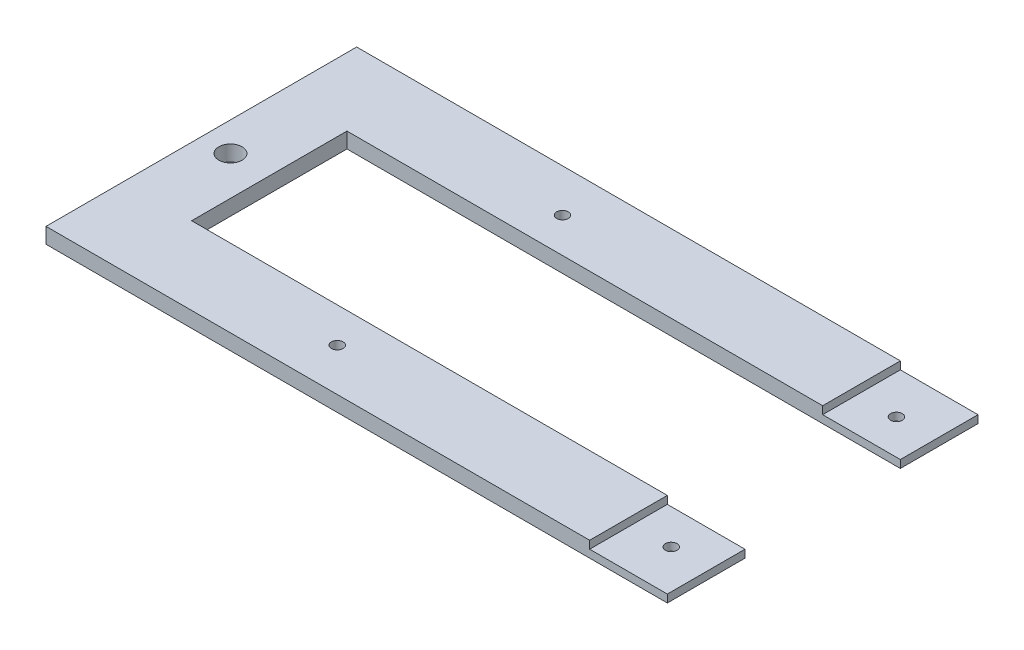
ISO-10303-21;
HEADER;
FILE_DESCRIPTION(('STEP AP214'),'2;1');
FILE_NAME('part.step','',(''),(''),'','','');
FILE_SCHEMA(('AUTOMOTIVE_DESIGN { 1 0 10303 214 1 1 1 1 }'));
ENDSEC;
DATA;
#1=APPLICATION_CONTEXT('core data for automotive mechanical design processes');
#2=APPLICATION_PROTOCOL_DEFINITION('international standard','automotive_design',2000,#1);
#3=PRODUCT_CONTEXT('',#1,'mechanical');
#4=PRODUCT('Part','Part','',(#3));
#5=PRODUCT_RELATED_PRODUCT_CATEGORY('part','',(#4));
#6=PRODUCT_DEFINITION_FORMATION('','',#4);
#7=PRODUCT_DEFINITION_CONTEXT('part definition',#1,'design');
#8=PRODUCT_DEFINITION('design','',#6,#7);
#9=PRODUCT_DEFINITION_SHAPE('','',#8);
#10=(LENGTH_UNIT() NAMED_UNIT(*) SI_UNIT(.MILLI.,.METRE.));
#11=(NAMED_UNIT(*) PLANE_ANGLE_UNIT() SI_UNIT($,.RADIAN.));
#12=(NAMED_UNIT(*) SI_UNIT($,.STERADIAN.) SOLID_ANGLE_UNIT());
#13=UNCERTAINTY_MEASURE_WITH_UNIT(LENGTH_MEASURE(1.E-05),#10,'distance_accuracy_value','');
#14=(GEOMETRIC_REPRESENTATION_CONTEXT(3) GLOBAL_UNCERTAINTY_ASSIGNED_CONTEXT((#13)) GLOBAL_UNIT_ASSIGNED_CONTEXT((#10,
#11,#12)) REPRESENTATION_CONTEXT('',''));
#15=CARTESIAN_POINT('',(0.,0.,0.));
#16=DIRECTION('',(0.,0.,1.));
#17=DIRECTION('',(1.,0.,0.));
#18=AXIS2_PLACEMENT_3D('',#15,#16,#17);
#19=CARTESIAN_POINT('',(0.,4.,0.));
#20=DIRECTION('',(0.,1.,0.));
#21=DIRECTION('',(0.,0.,1.));
#22=AXIS2_PLACEMENT_3D('',#19,#20,#21);
#23=PLANE('',#22);
#24=CARTESIAN_POINT('',(64.,4.,-29.));
#25=DIRECTION('',(0.,1.,0.));
#26=DIRECTION('',(0.,0.,1.));
#27=AXIS2_PLACEMENT_3D('',#24,#25,#26);
#28=CIRCLE('',#27,1.5);
#29=CARTESIAN_POINT('',(64.,4.,-27.5));
#30=VERTEX_POINT('',#29);
#31=EDGE_CURVE('E191',#30,#30,#28,.T.);
#32=ORIENTED_EDGE('',*,*,#31,.F.);
#33=EDGE_LOOP('',(#32));
#34=FACE_BOUND('',#33,.T.);
#35=CARTESIAN_POINT('',(64.,4.,29.));
#36=DIRECTION('',(0.,1.,0.));
#37=DIRECTION('',(0.,0.,1.));
#38=AXIS2_PLACEMENT_3D('',#35,#36,#37);
#39=CIRCLE('',#38,1.5);
#40=CARTESIAN_POINT('',(64.,4.,30.5));
#41=VERTEX_POINT('',#40);
#42=EDGE_CURVE('E188',#41,#41,#39,.F.);
#43=ORIENTED_EDGE('',*,*,#42,.T.);
#44=EDGE_LOOP('',(#43));
#45=FACE_BOUND('',#44,.T.);
#46=CARTESIAN_POINT('',(7.5,4.,0.));
#47=DIRECTION('',(0.,1.,0.));
#48=DIRECTION('',(0.,0.,1.));
#49=AXIS2_PLACEMENT_3D('',#46,#47,#48);
#50=CIRCLE('',#49,3.);
#51=CARTESIAN_POINT('',(7.5,4.,3.));
#52=VERTEX_POINT('',#51);
#53=EDGE_CURVE('E185',#52,#52,#50,.T.);
#54=ORIENTED_EDGE('',*,*,#53,.F.);
#55=EDGE_LOOP('',(#54));
#56=FACE_BOUND('',#55,.T.);
#57=DIRECTION('',(-1.,0.,0.));
#58=VECTOR('',#57,1.);
#59=CARTESIAN_POINT('',(0.,4.,-20.));
#60=LINE('',#59,#58);
#61=CARTESIAN_POINT('',(140.,4.,-20.));
#62=VERTEX_POINT('',#61);
#63=CARTESIAN_POINT('',(17.5,4.,-20.));
#64=VERTEX_POINT('',#63);
#65=EDGE_CURVE('E183',#62,#64,#60,.T.);
#66=ORIENTED_EDGE('',*,*,#65,.F.);
#67=DIRECTION('',(0.,0.,1.));
#68=VECTOR('',#67,1.);
#69=CARTESIAN_POINT('',(140.,4.,-20.));
#70=LINE('',#69,#68);
#71=CARTESIAN_POINT('',(140.,4.,-40.));
#72=VERTEX_POINT('',#71);
#73=EDGE_CURVE('E137',#72,#62,#70,.T.);
#74=ORIENTED_EDGE('',*,*,#73,.F.);
#75=DIRECTION('',(1.,0.,0.));
#76=VECTOR('',#75,1.);
#77=CARTESIAN_POINT('',(0.,4.,-40.));
#78=LINE('',#77,#76);
#79=CARTESIAN_POINT('',(0.,4.,-40.));
#80=VERTEX_POINT('',#79);
#81=EDGE_CURVE('E168',#80,#72,#78,.T.);
#82=ORIENTED_EDGE('',*,*,#81,.F.);
#83=DIRECTION('',(0.,0.,-1.));
#84=VECTOR('',#83,1.);
#85=CARTESIAN_POINT('',(0.,4.,0.));
#86=LINE('',#85,#84);
#87=CARTESIAN_POINT('',(0.,4.,40.));
#88=VERTEX_POINT('',#87);
#89=EDGE_CURVE('E171',#88,#80,#86,.T.);
#90=ORIENTED_EDGE('',*,*,#89,.F.);
#91=DIRECTION('',(1.,0.,0.));
#92=VECTOR('',#91,1.);
#93=CARTESIAN_POINT('',(0.,4.,40.));
#94=LINE('',#93,#92);
#95=CARTESIAN_POINT('',(140.,4.,40.));
#96=VERTEX_POINT('',#95);
#97=EDGE_CURVE('E175',#88,#96,#94,.T.);
#98=ORIENTED_EDGE('',*,*,#97,.T.);
#99=DIRECTION('',(0.,0.,1.));
#100=VECTOR('',#99,1.);
#101=CARTESIAN_POINT('',(140.,4.,20.));
#102=LINE('',#101,#100);
#103=CARTESIAN_POINT('',(140.,4.,20.));
#104=VERTEX_POINT('',#103);
#105=EDGE_CURVE('E153',#104,#96,#102,.T.);
#106=ORIENTED_EDGE('',*,*,#105,.F.);
#107=DIRECTION('',(-1.,0.,0.));
#108=VECTOR('',#107,1.);
#109=CARTESIAN_POINT('',(0.,4.,20.));
#110=LINE('',#109,#108);
#111=CARTESIAN_POINT('',(17.5,4.,20.));
#112=VERTEX_POINT('',#111);
#113=EDGE_CURVE('E178',#104,#112,#110,.T.);
#114=ORIENTED_EDGE('',*,*,#113,.T.);
#115=DIRECTION('',(0.,0.,1.));
#116=VECTOR('',#115,1.);
#117=CARTESIAN_POINT('',(17.5,4.,0.));
#118=LINE('',#117,#116);
#119=EDGE_CURVE('E180',#64,#112,#118,.T.);
#120=ORIENTED_EDGE('',*,*,#119,.F.);
#121=EDGE_LOOP('',(#66,#74,#82,#90,#98,#106,#114,#120));
#122=FACE_BOUND('',#121,.T.);
#123=ADVANCED_FACE('F36',(#34,#45,#56,#122),#23,.T.);
#124=CARTESIAN_POINT('',(0.,4.,-40.));
#125=DIRECTION('',(0.,0.,-1.));
#126=DIRECTION('',(-1.,0.,0.));
#127=AXIS2_PLACEMENT_3D('',#124,#125,#126);
#128=PLANE('',#127);
#129=DIRECTION('',(1.,0.,0.));
#130=VECTOR('',#129,1.);
#131=CARTESIAN_POINT('',(140.,2.,-40.));
#132=LINE('',#131,#130);
#133=CARTESIAN_POINT('',(140.,2.,-40.));
#134=VERTEX_POINT('',#133);
#135=CARTESIAN_POINT('',(160.,2.,-40.));
#136=VERTEX_POINT('',#135);
#137=EDGE_CURVE('E132',#134,#136,#132,.T.);
#138=ORIENTED_EDGE('',*,*,#137,.T.);
#139=DIRECTION('',(0.,-1.,0.));
#140=VECTOR('',#139,1.);
#141=CARTESIAN_POINT('',(160.,4.,-40.));
#142=LINE('',#141,#140);
#143=CARTESIAN_POINT('',(160.,0.,-40.));
#144=VERTEX_POINT('',#143);
#145=EDGE_CURVE('E194',#136,#144,#142,.T.);
#146=ORIENTED_EDGE('',*,*,#145,.T.);
#147=DIRECTION('',(1.,0.,0.));
#148=VECTOR('',#147,1.);
#149=CARTESIAN_POINT('',(0.,0.,-40.));
#150=LINE('',#149,#148);
#151=CARTESIAN_POINT('',(0.,0.,-40.));
#152=VERTEX_POINT('',#151);
#153=EDGE_CURVE('E195',#152,#144,#150,.T.);
#154=ORIENTED_EDGE('',*,*,#153,.F.);
#155=DIRECTION('',(0.,-1.,0.));
#156=VECTOR('',#155,1.);
#157=CARTESIAN_POINT('',(0.,4.,-40.));
#158=LINE('',#157,#156);
#159=EDGE_CURVE('E11',#80,#152,#158,.T.);
#160=ORIENTED_EDGE('',*,*,#159,.F.);
#161=ORIENTED_EDGE('',*,*,#81,.T.);
#162=DIRECTION('',(0.,1.,0.));
#163=VECTOR('',#162,1.);
#164=CARTESIAN_POINT('',(140.,4.,-40.));
#165=LINE('',#164,#163);
#166=EDGE_CURVE('E60',#134,#72,#165,.T.);
#167=ORIENTED_EDGE('',*,*,#166,.F.);
#168=EDGE_LOOP('',(#138,#146,#154,#160,#161,#167));
#169=FACE_BOUND('',#168,.T.);
#170=ADVANCED_FACE('F38',(#169),#128,.T.);
#171=CARTESIAN_POINT('',(0.,4.,0.));
#172=DIRECTION('',(-1.,0.,0.));
#173=DIRECTION('',(0.,0.,1.));
#174=AXIS2_PLACEMENT_3D('',#171,#172,#173);
#175=PLANE('',#174);
#176=DIRECTION('',(0.,0.,-1.));
#177=VECTOR('',#176,1.);
#178=CARTESIAN_POINT('',(0.,0.,0.));
#179=LINE('',#178,#177);
#180=CARTESIAN_POINT('',(0.,0.,40.));
#181=VERTEX_POINT('',#180);
#182=EDGE_CURVE('E198',#181,#152,#179,.T.);
#183=ORIENTED_EDGE('',*,*,#182,.F.);
#184=DIRECTION('',(0.,-1.,0.));
#185=VECTOR('',#184,1.);
#186=CARTESIAN_POINT('',(0.,4.,40.));
#187=LINE('',#186,#185);
#188=EDGE_CURVE('E45',#88,#181,#187,.T.);
#189=ORIENTED_EDGE('',*,*,#188,.F.);
#190=ORIENTED_EDGE('',*,*,#89,.T.);
#191=ORIENTED_EDGE('',*,*,#159,.T.);
#192=EDGE_LOOP('',(#183,#189,#190,#191));
#193=FACE_BOUND('',#192,.T.);
#194=ADVANCED_FACE('F257',(#193),#175,.T.);
#195=CARTESIAN_POINT('',(0.,4.,40.));
#196=DIRECTION('',(0.,0.,-1.));
#197=DIRECTION('',(-1.,0.,0.));
#198=AXIS2_PLACEMENT_3D('',#195,#196,#197);
#199=PLANE('',#198);
#200=DIRECTION('',(0.,-1.,0.));
#201=VECTOR('',#200,1.);
#202=CARTESIAN_POINT('',(160.,4.,40.));
#203=LINE('',#202,#201);
#204=CARTESIAN_POINT('',(160.,2.,40.));
#205=VERTEX_POINT('',#204);
#206=CARTESIAN_POINT('',(160.,0.,40.));
#207=VERTEX_POINT('',#206);
#208=EDGE_CURVE('E241',#205,#207,#203,.T.);
#209=ORIENTED_EDGE('',*,*,#208,.F.);
#210=DIRECTION('',(1.,0.,0.));
#211=VECTOR('',#210,1.);
#212=CARTESIAN_POINT('',(140.,2.,40.));
#213=LINE('',#212,#211);
#214=CARTESIAN_POINT('',(140.,2.,40.));
#215=VERTEX_POINT('',#214);
#216=EDGE_CURVE('E160',#215,#205,#213,.T.);
#217=ORIENTED_EDGE('',*,*,#216,.F.);
#218=DIRECTION('',(0.,-1.,0.));
#219=VECTOR('',#218,1.);
#220=CARTESIAN_POINT('',(140.,4.,40.));
#221=LINE('',#220,#219);
#222=EDGE_CURVE('E156',#96,#215,#221,.T.);
#223=ORIENTED_EDGE('',*,*,#222,.F.);
#224=ORIENTED_EDGE('',*,*,#97,.F.);
#225=ORIENTED_EDGE('',*,*,#188,.T.);
#226=DIRECTION('',(1.,0.,0.));
#227=VECTOR('',#226,1.);
#228=CARTESIAN_POINT('',(0.,0.,40.));
#229=LINE('',#228,#227);
#230=EDGE_CURVE('E201',#181,#207,#229,.T.);
#231=ORIENTED_EDGE('',*,*,#230,.T.);
#232=EDGE_LOOP('',(#209,#217,#223,#224,#225,#231));
#233=FACE_BOUND('',#232,.T.);
#234=ADVANCED_FACE('F247',(#233),#199,.F.);
#235=CARTESIAN_POINT('',(160.,4.,0.));
#236=DIRECTION('',(-1.,0.,0.));
#237=DIRECTION('',(0.,0.,1.));
#238=AXIS2_PLACEMENT_3D('',#235,#236,#237);
#239=PLANE('',#238);
#240=DIRECTION('',(0.,-1.,0.));
#241=VECTOR('',#240,1.);
#242=CARTESIAN_POINT('',(160.,4.,20.));
#243=LINE('',#242,#241);
#244=CARTESIAN_POINT('',(160.,2.,20.));
#245=VERTEX_POINT('',#244);
#246=CARTESIAN_POINT('',(160.,0.,20.));
#247=VERTEX_POINT('',#246);
#248=EDGE_CURVE('E239',#245,#247,#243,.T.);
#249=ORIENTED_EDGE('',*,*,#248,.F.);
#250=DIRECTION('',(0.,0.,-1.));
#251=VECTOR('',#250,1.);
#252=CARTESIAN_POINT('',(160.,2.,20.));
#253=LINE('',#252,#251);
#254=EDGE_CURVE('E154',#205,#245,#253,.T.);
#255=ORIENTED_EDGE('',*,*,#254,.F.);
#256=ORIENTED_EDGE('',*,*,#208,.T.);
#257=DIRECTION('',(0.,0.,-1.));
#258=VECTOR('',#257,1.);
#259=CARTESIAN_POINT('',(160.,0.,0.));
#260=LINE('',#259,#258);
#261=EDGE_CURVE('E204',#207,#247,#260,.T.);
#262=ORIENTED_EDGE('',*,*,#261,.T.);
#263=EDGE_LOOP('',(#249,#255,#256,#262));
#264=FACE_BOUND('',#263,.T.);
#265=ADVANCED_FACE('F277',(#264),#239,.F.);
#266=CARTESIAN_POINT('',(0.,4.,20.));
#267=DIRECTION('',(0.,0.,1.));
#268=DIRECTION('',(1.,0.,0.));
#269=AXIS2_PLACEMENT_3D('',#266,#267,#268);
#270=PLANE('',#269);
#271=DIRECTION('',(0.,1.,0.));
#272=VECTOR('',#271,1.);
#273=CARTESIAN_POINT('',(140.,4.,20.));
#274=LINE('',#273,#272);
#275=CARTESIAN_POINT('',(140.,2.,20.));
#276=VERTEX_POINT('',#275);
#277=EDGE_CURVE('E52',#276,#104,#274,.T.);
#278=ORIENTED_EDGE('',*,*,#277,.F.);
#279=DIRECTION('',(1.,0.,0.));
#280=VECTOR('',#279,1.);
#281=CARTESIAN_POINT('',(140.,2.,20.));
#282=LINE('',#281,#280);
#283=EDGE_CURVE('E162',#276,#245,#282,.T.);
#284=ORIENTED_EDGE('',*,*,#283,.T.);
#285=ORIENTED_EDGE('',*,*,#248,.T.);
#286=DIRECTION('',(-1.,0.,0.));
#287=VECTOR('',#286,1.);
#288=CARTESIAN_POINT('',(0.,0.,20.));
#289=LINE('',#288,#287);
#290=CARTESIAN_POINT('',(17.5,0.,20.));
#291=VERTEX_POINT('',#290);
#292=EDGE_CURVE('E207',#247,#291,#289,.T.);
#293=ORIENTED_EDGE('',*,*,#292,.T.);
#294=DIRECTION('',(0.,-1.,0.));
#295=VECTOR('',#294,1.);
#296=CARTESIAN_POINT('',(17.5,4.,20.));
#297=LINE('',#296,#295);
#298=EDGE_CURVE('E237',#112,#291,#297,.T.);
#299=ORIENTED_EDGE('',*,*,#298,.F.);
#300=ORIENTED_EDGE('',*,*,#113,.F.);
#301=EDGE_LOOP('',(#278,#284,#285,#293,#299,#300));
#302=FACE_BOUND('',#301,.T.);
#303=ADVANCED_FACE('F273',(#302),#270,.F.);
#304=CARTESIAN_POINT('',(17.5,4.,0.));
#305=DIRECTION('',(1.,0.,0.));
#306=DIRECTION('',(0.,0.,-1.));
#307=AXIS2_PLACEMENT_3D('',#304,#305,#306);
#308=PLANE('',#307);
#309=DIRECTION('',(0.,0.,1.));
#310=VECTOR('',#309,1.);
#311=CARTESIAN_POINT('',(17.5,0.,0.));
#312=LINE('',#311,#310);
#313=CARTESIAN_POINT('',(17.5,0.,-20.));
#314=VERTEX_POINT('',#313);
#315=EDGE_CURVE('E210',#314,#291,#312,.T.);
#316=ORIENTED_EDGE('',*,*,#315,.F.);
#317=DIRECTION('',(0.,-1.,0.));
#318=VECTOR('',#317,1.);
#319=CARTESIAN_POINT('',(17.5,4.,-20.));
#320=LINE('',#319,#318);
#321=EDGE_CURVE('E235',#64,#314,#320,.T.);
#322=ORIENTED_EDGE('',*,*,#321,.F.);
#323=ORIENTED_EDGE('',*,*,#119,.T.);
#324=ORIENTED_EDGE('',*,*,#298,.T.);
#325=EDGE_LOOP('',(#316,#322,#323,#324));
#326=FACE_BOUND('',#325,.T.);
#327=ADVANCED_FACE('F268',(#326),#308,.T.);
#328=CARTESIAN_POINT('',(0.,4.,-20.));
#329=DIRECTION('',(0.,0.,1.));
#330=DIRECTION('',(1.,0.,0.));
#331=AXIS2_PLACEMENT_3D('',#328,#329,#330);
#332=PLANE('',#331);
#333=DIRECTION('',(1.,0.,0.));
#334=VECTOR('',#333,1.);
#335=CARTESIAN_POINT('',(140.,2.,-20.));
#336=LINE('',#335,#334);
#337=CARTESIAN_POINT('',(140.,2.,-20.));
#338=VERTEX_POINT('',#337);
#339=CARTESIAN_POINT('',(160.,2.,-20.));
#340=VERTEX_POINT('',#339);
#341=EDGE_CURVE('E129',#338,#340,#336,.T.);
#342=ORIENTED_EDGE('',*,*,#341,.F.);
#343=DIRECTION('',(0.,-1.,0.));
#344=VECTOR('',#343,1.);
#345=CARTESIAN_POINT('',(140.,4.,-20.));
#346=LINE('',#345,#344);
#347=EDGE_CURVE('E133',#62,#338,#346,.T.);
#348=ORIENTED_EDGE('',*,*,#347,.F.);
#349=ORIENTED_EDGE('',*,*,#65,.T.);
#350=ORIENTED_EDGE('',*,*,#321,.T.);
#351=DIRECTION('',(-1.,0.,0.));
#352=VECTOR('',#351,1.);
#353=CARTESIAN_POINT('',(0.,0.,-20.));
#354=LINE('',#353,#352);
#355=CARTESIAN_POINT('',(160.,0.,-20.));
#356=VERTEX_POINT('',#355);
#357=EDGE_CURVE('E213',#356,#314,#354,.T.);
#358=ORIENTED_EDGE('',*,*,#357,.F.);
#359=DIRECTION('',(0.,-1.,0.));
#360=VECTOR('',#359,1.);
#361=CARTESIAN_POINT('',(160.,4.,-20.));
#362=LINE('',#361,#360);
#363=EDGE_CURVE('E145',#340,#356,#362,.T.);
#364=ORIENTED_EDGE('',*,*,#363,.F.);
#365=EDGE_LOOP('',(#342,#348,#349,#350,#358,#364));
#366=FACE_BOUND('',#365,.T.);
#367=ADVANCED_FACE('F143',(#366),#332,.T.);
#368=CARTESIAN_POINT('',(150.,4.,-29.));
#369=DIRECTION('',(0.,-1.,0.));
#370=DIRECTION('',(0.,0.,-1.));
#371=AXIS2_PLACEMENT_3D('',#368,#369,#370);
#372=CYLINDRICAL_SURFACE('',#371,1.5);
#373=CARTESIAN_POINT('',(150.,2.,-29.));
#374=DIRECTION('',(0.,-1.,0.));
#375=DIRECTION('',(0.,0.,-1.));
#376=AXIS2_PLACEMENT_3D('',#373,#374,#375);
#377=CIRCLE('',#376,1.5);
#378=CARTESIAN_POINT('',(150.,2.,-30.5));
#379=VERTEX_POINT('',#378);
#380=EDGE_CURVE('E147',#379,#379,#377,.T.);
#381=ORIENTED_EDGE('',*,*,#380,.F.);
#382=EDGE_LOOP('',(#381));
#383=FACE_BOUND('',#382,.T.);
#384=CARTESIAN_POINT('',(150.,0.,-29.));
#385=DIRECTION('',(0.,1.,0.));
#386=DIRECTION('',(0.,0.,1.));
#387=AXIS2_PLACEMENT_3D('',#384,#385,#386);
#388=CIRCLE('',#387,1.5);
#389=CARTESIAN_POINT('',(150.,0.,-27.5));
#390=VERTEX_POINT('',#389);
#391=EDGE_CURVE('E228',#390,#390,#388,.T.);
#392=ORIENTED_EDGE('',*,*,#391,.F.);
#393=EDGE_LOOP('',(#392));
#394=FACE_BOUND('',#393,.T.);
#395=ADVANCED_FACE('F303',(#383,#394),#372,.F.);
#396=CARTESIAN_POINT('',(64.,4.,29.));
#397=DIRECTION('',(0.,-1.,0.));
#398=DIRECTION('',(0.,0.,-1.));
#399=AXIS2_PLACEMENT_3D('',#396,#397,#398);
#400=CYLINDRICAL_SURFACE('',#399,1.5);
#401=ORIENTED_EDGE('',*,*,#42,.F.);
#402=EDGE_LOOP('',(#401));
#403=FACE_BOUND('',#402,.T.);
#404=CARTESIAN_POINT('',(64.,0.,29.));
#405=DIRECTION('',(0.,1.,0.));
#406=DIRECTION('',(0.,0.,1.));
#407=AXIS2_PLACEMENT_3D('',#404,#405,#406);
#408=CIRCLE('',#407,1.5);
#409=CARTESIAN_POINT('',(64.,0.,30.5));
#410=VERTEX_POINT('',#409);
#411=EDGE_CURVE('E225',#410,#410,#408,.F.);
#412=ORIENTED_EDGE('',*,*,#411,.T.);
#413=EDGE_LOOP('',(#412));
#414=FACE_BOUND('',#413,.T.);
#415=ADVANCED_FACE('F306',(#403,#414),#400,.F.);
#416=CARTESIAN_POINT('',(7.5,4.,0.));
#417=DIRECTION('',(0.,-1.,0.));
#418=DIRECTION('',(0.,0.,-1.));
#419=AXIS2_PLACEMENT_3D('',#416,#417,#418);
#420=CYLINDRICAL_SURFACE('',#419,3.);
#421=ORIENTED_EDGE('',*,*,#53,.T.);
#422=EDGE_LOOP('',(#421));
#423=FACE_BOUND('',#422,.T.);
#424=CARTESIAN_POINT('',(7.5,0.,0.));
#425=DIRECTION('',(0.,1.,0.));
#426=DIRECTION('',(0.,0.,1.));
#427=AXIS2_PLACEMENT_3D('',#424,#425,#426);
#428=CIRCLE('',#427,3.);
#429=CARTESIAN_POINT('',(7.5,0.,3.));
#430=VERTEX_POINT('',#429);
#431=EDGE_CURVE('E222',#430,#430,#428,.T.);
#432=ORIENTED_EDGE('',*,*,#431,.F.);
#433=EDGE_LOOP('',(#432));
#434=FACE_BOUND('',#433,.T.);
#435=ADVANCED_FACE('F310',(#423,#434),#420,.F.);
#436=CARTESIAN_POINT('',(150.,4.,29.));
#437=DIRECTION('',(0.,-1.,0.));
#438=DIRECTION('',(0.,0.,-1.));
#439=AXIS2_PLACEMENT_3D('',#436,#437,#438);
#440=CYLINDRICAL_SURFACE('',#439,1.5);
#441=CARTESIAN_POINT('',(150.,2.,29.));
#442=DIRECTION('',(0.,-1.,0.));
#443=DIRECTION('',(0.,0.,-1.));
#444=AXIS2_PLACEMENT_3D('',#441,#442,#443);
#445=CIRCLE('',#444,1.5);
#446=CARTESIAN_POINT('',(150.,2.,27.5));
#447=VERTEX_POINT('',#446);
#448=EDGE_CURVE('E40',#447,#447,#445,.F.);
#449=ORIENTED_EDGE('',*,*,#448,.T.);
#450=EDGE_LOOP('',(#449));
#451=FACE_BOUND('',#450,.T.);
#452=CARTESIAN_POINT('',(150.,0.,29.));
#453=DIRECTION('',(0.,1.,0.));
#454=DIRECTION('',(0.,0.,1.));
#455=AXIS2_PLACEMENT_3D('',#452,#453,#454);
#456=CIRCLE('',#455,1.5);
#457=CARTESIAN_POINT('',(150.,0.,30.5));
#458=VERTEX_POINT('',#457);
#459=EDGE_CURVE('E219',#458,#458,#456,.F.);
#460=ORIENTED_EDGE('',*,*,#459,.T.);
#461=EDGE_LOOP('',(#460));
#462=FACE_BOUND('',#461,.T.);
#463=ADVANCED_FACE('F314',(#451,#462),#440,.F.);
#464=CARTESIAN_POINT('',(160.,4.,0.));
#465=DIRECTION('',(1.,0.,0.));
#466=DIRECTION('',(0.,0.,-1.));
#467=AXIS2_PLACEMENT_3D('',#464,#465,#466);
#468=PLANE('',#467);
#469=DIRECTION('',(0.,0.,-1.));
#470=VECTOR('',#469,1.);
#471=CARTESIAN_POINT('',(160.,2.,-20.));
#472=LINE('',#471,#470);
#473=EDGE_CURVE('E140',#340,#136,#472,.T.);
#474=ORIENTED_EDGE('',*,*,#473,.F.);
#475=ORIENTED_EDGE('',*,*,#363,.T.);
#476=DIRECTION('',(0.,0.,1.));
#477=VECTOR('',#476,1.);
#478=CARTESIAN_POINT('',(160.,0.,0.));
#479=LINE('',#478,#477);
#480=EDGE_CURVE('E216',#144,#356,#479,.T.);
#481=ORIENTED_EDGE('',*,*,#480,.F.);
#482=ORIENTED_EDGE('',*,*,#145,.F.);
#483=EDGE_LOOP('',(#474,#475,#481,#482));
#484=FACE_BOUND('',#483,.T.);
#485=ADVANCED_FACE('F264',(#484),#468,.T.);
#486=CARTESIAN_POINT('',(64.,4.,-29.));
#487=DIRECTION('',(0.,-1.,0.));
#488=DIRECTION('',(0.,0.,-1.));
#489=AXIS2_PLACEMENT_3D('',#486,#487,#488);
#490=CYLINDRICAL_SURFACE('',#489,1.5);
#491=ORIENTED_EDGE('',*,*,#31,.T.);
#492=EDGE_LOOP('',(#491));
#493=FACE_BOUND('',#492,.T.);
#494=CARTESIAN_POINT('',(64.,0.,-29.));
#495=DIRECTION('',(0.,1.,0.));
#496=DIRECTION('',(0.,0.,1.));
#497=AXIS2_PLACEMENT_3D('',#494,#495,#496);
#498=CIRCLE('',#497,1.5);
#499=CARTESIAN_POINT('',(64.,0.,-27.5));
#500=VERTEX_POINT('',#499);
#501=EDGE_CURVE('E172',#500,#500,#498,.T.);
#502=ORIENTED_EDGE('',*,*,#501,.F.);
#503=EDGE_LOOP('',(#502));
#504=FACE_BOUND('',#503,.T.);
#505=ADVANCED_FACE('F299',(#493,#504),#490,.F.);
#506=CARTESIAN_POINT('',(0.,0.,0.));
#507=DIRECTION('',(0.,1.,0.));
#508=DIRECTION('',(0.,0.,1.));
#509=AXIS2_PLACEMENT_3D('',#506,#507,#508);
#510=PLANE('',#509);
#511=ORIENTED_EDGE('',*,*,#153,.T.);
#512=ORIENTED_EDGE('',*,*,#480,.T.);
#513=ORIENTED_EDGE('',*,*,#357,.T.);
#514=ORIENTED_EDGE('',*,*,#315,.T.);
#515=ORIENTED_EDGE('',*,*,#292,.F.);
#516=ORIENTED_EDGE('',*,*,#261,.F.);
#517=ORIENTED_EDGE('',*,*,#230,.F.);
#518=ORIENTED_EDGE('',*,*,#182,.T.);
#519=EDGE_LOOP('',(#511,#512,#513,#514,#515,#516,#517,#518));
#520=FACE_BOUND('',#519,.T.);
#521=ORIENTED_EDGE('',*,*,#459,.F.);
#522=EDGE_LOOP('',(#521));
#523=FACE_BOUND('',#522,.T.);
#524=ORIENTED_EDGE('',*,*,#431,.T.);
#525=EDGE_LOOP('',(#524));
#526=FACE_BOUND('',#525,.T.);
#527=ORIENTED_EDGE('',*,*,#411,.F.);
#528=EDGE_LOOP('',(#527));
#529=FACE_BOUND('',#528,.T.);
#530=ORIENTED_EDGE('',*,*,#391,.T.);
#531=EDGE_LOOP('',(#530));
#532=FACE_BOUND('',#531,.T.);
#533=ORIENTED_EDGE('',*,*,#501,.T.);
#534=EDGE_LOOP('',(#533));
#535=FACE_BOUND('',#534,.T.);
#536=ADVANCED_FACE('F254',(#520,#523,#526,#529,#532,#535),#510,.F.);
#537=CARTESIAN_POINT('',(140.,2.,20.));
#538=DIRECTION('',(0.,-1.,0.));
#539=DIRECTION('',(0.,0.,-1.));
#540=AXIS2_PLACEMENT_3D('',#537,#538,#539);
#541=PLANE('',#540);
#542=ORIENTED_EDGE('',*,*,#254,.T.);
#543=ORIENTED_EDGE('',*,*,#283,.F.);
#544=DIRECTION('',(0.,0.,-1.));
#545=VECTOR('',#544,1.);
#546=CARTESIAN_POINT('',(140.,2.,20.));
#547=LINE('',#546,#545);
#548=EDGE_CURVE('E158',#215,#276,#547,.T.);
#549=ORIENTED_EDGE('',*,*,#548,.F.);
#550=ORIENTED_EDGE('',*,*,#216,.T.);
#551=EDGE_LOOP('',(#542,#543,#549,#550));
#552=FACE_BOUND('',#551,.T.);
#553=ORIENTED_EDGE('',*,*,#448,.F.);
#554=EDGE_LOOP('',(#553));
#555=FACE_BOUND('',#554,.T.);
#556=ADVANCED_FACE('F281',(#552,#555),#541,.F.);
#557=CARTESIAN_POINT('',(140.,0.,0.));
#558=DIRECTION('',(-1.,0.,0.));
#559=DIRECTION('',(0.,0.,1.));
#560=AXIS2_PLACEMENT_3D('',#557,#558,#559);
#561=PLANE('',#560);
#562=ORIENTED_EDGE('',*,*,#277,.T.);
#563=ORIENTED_EDGE('',*,*,#105,.T.);
#564=ORIENTED_EDGE('',*,*,#222,.T.);
#565=ORIENTED_EDGE('',*,*,#548,.T.);
#566=EDGE_LOOP('',(#562,#563,#564,#565));
#567=FACE_BOUND('',#566,.T.);
#568=ADVANCED_FACE('F283',(#567),#561,.F.);
#569=CARTESIAN_POINT('',(140.,2.,-20.));
#570=DIRECTION('',(0.,-1.,0.));
#571=DIRECTION('',(0.,0.,-1.));
#572=AXIS2_PLACEMENT_3D('',#569,#570,#571);
#573=PLANE('',#572);
#574=ORIENTED_EDGE('',*,*,#380,.T.);
#575=EDGE_LOOP('',(#574));
#576=FACE_BOUND('',#575,.T.);
#577=ORIENTED_EDGE('',*,*,#473,.T.);
#578=ORIENTED_EDGE('',*,*,#137,.F.);
#579=DIRECTION('',(0.,0.,-1.));
#580=VECTOR('',#579,1.);
#581=CARTESIAN_POINT('',(140.,2.,-20.));
#582=LINE('',#581,#580);
#583=EDGE_CURVE('E125',#338,#134,#582,.T.);
#584=ORIENTED_EDGE('',*,*,#583,.F.);
#585=ORIENTED_EDGE('',*,*,#341,.T.);
#586=EDGE_LOOP('',(#577,#578,#584,#585));
#587=FACE_BOUND('',#586,.T.);
#588=ADVANCED_FACE('F127',(#576,#587),#573,.F.);
#589=CARTESIAN_POINT('',(140.,0.,0.));
#590=DIRECTION('',(1.,0.,0.));
#591=DIRECTION('',(0.,0.,-1.));
#592=AXIS2_PLACEMENT_3D('',#589,#590,#591);
#593=PLANE('',#592);
#594=ORIENTED_EDGE('',*,*,#347,.T.);
#595=ORIENTED_EDGE('',*,*,#583,.T.);
#596=ORIENTED_EDGE('',*,*,#166,.T.);
#597=ORIENTED_EDGE('',*,*,#73,.T.);
#598=EDGE_LOOP('',(#594,#595,#596,#597));
#599=FACE_BOUND('',#598,.T.);
#600=ADVANCED_FACE('F136',(#599),#593,.T.);
#601=CLOSED_SHELL('',(#123,#170,#194,#234,#265,#303,#327,#367,#395,#415,#435,#463,#485,#505,
#536,#556,#568,#588,#600));
#602=MANIFOLD_SOLID_BREP('B2',#601);
#603=ADVANCED_BREP_SHAPE_REPRESENTATION('',(#18,#602),#14);
#604=SHAPE_DEFINITION_REPRESENTATION(#9,#603);
ENDSEC;
END-ISO-10303-21;
